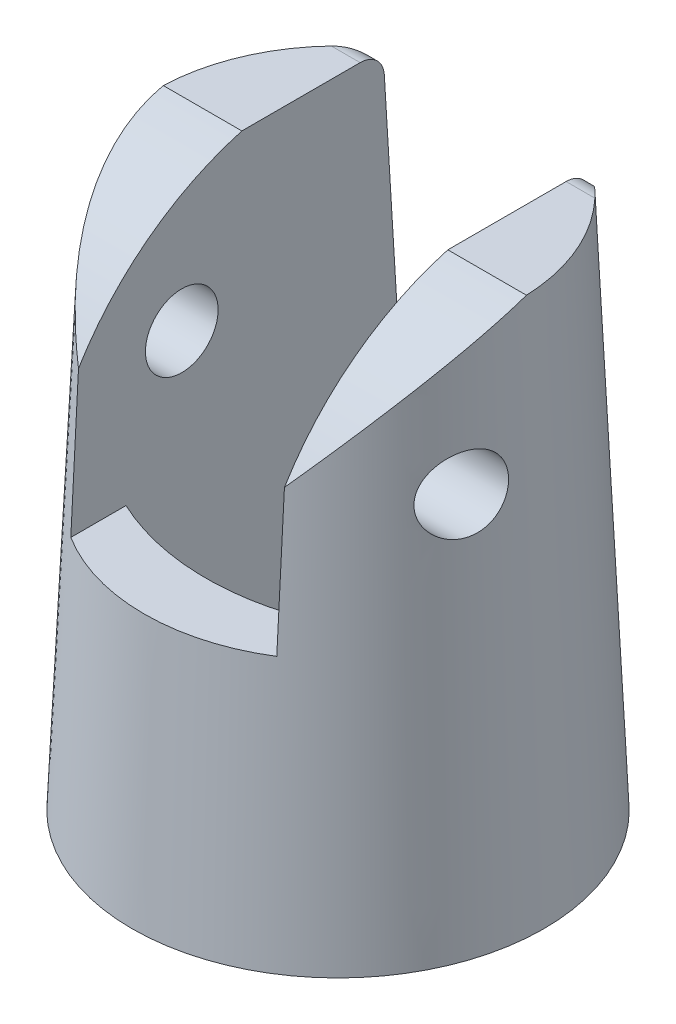
ISO-10303-21;
HEADER;
FILE_DESCRIPTION(('STEP AP214'),'2;1');
FILE_NAME('part.step','',(''),(''),'','','');
FILE_SCHEMA(('AUTOMOTIVE_DESIGN { 1 0 10303 214 1 1 1 1 }'));
ENDSEC;
DATA;
#1=APPLICATION_CONTEXT('core data for automotive mechanical design processes');
#2=APPLICATION_PROTOCOL_DEFINITION('international standard','automotive_design',2000,#1);
#3=PRODUCT_CONTEXT('',#1,'mechanical');
#4=PRODUCT('Part','Part','',(#3));
#5=PRODUCT_RELATED_PRODUCT_CATEGORY('part','',(#4));
#6=PRODUCT_DEFINITION_FORMATION('','',#4);
#7=PRODUCT_DEFINITION_CONTEXT('part definition',#1,'design');
#8=PRODUCT_DEFINITION('design','',#6,#7);
#9=PRODUCT_DEFINITION_SHAPE('','',#8);
#10=(LENGTH_UNIT() NAMED_UNIT(*) SI_UNIT(.MILLI.,.METRE.));
#11=(NAMED_UNIT(*) PLANE_ANGLE_UNIT() SI_UNIT($,.RADIAN.));
#12=(NAMED_UNIT(*) SI_UNIT($,.STERADIAN.) SOLID_ANGLE_UNIT());
#13=UNCERTAINTY_MEASURE_WITH_UNIT(LENGTH_MEASURE(1.E-05),#10,'distance_accuracy_value','');
#14=(GEOMETRIC_REPRESENTATION_CONTEXT(3) GLOBAL_UNCERTAINTY_ASSIGNED_CONTEXT((#13)) GLOBAL_UNIT_ASSIGNED_CONTEXT((#10,
#11,#12)) REPRESENTATION_CONTEXT('',''));
#15=CARTESIAN_POINT('',(0.,0.,0.));
#16=DIRECTION('',(0.,0.,1.));
#17=DIRECTION('',(1.,0.,0.));
#18=AXIS2_PLACEMENT_3D('',#15,#16,#17);
#19=CARTESIAN_POINT('',(-3.542375,9.1685,8.335));
#20=DIRECTION('',(0.,1.,0.));
#21=DIRECTION('',(0.,0.,1.));
#22=AXIS2_PLACEMENT_3D('',#19,#20,#21);
#23=PLANE('',#22);
#24=CARTESIAN_POINT('',(0.,9.1685,-3.79403656817905));
#25=DIRECTION('',(0.,1.,0.));
#26=DIRECTION('',(0.,0.,1.));
#27=AXIS2_PLACEMENT_3D('',#24,#25,#26);
#28=CIRCLE('',#27,8.335);
#29=CARTESIAN_POINT('',(-3.542375,9.1685,3.75075));
#30=VERTEX_POINT('',#29);
#31=CARTESIAN_POINT('',(3.542375,9.1685,3.75075));
#32=VERTEX_POINT('',#31);
#33=EDGE_CURVE('E169',#30,#32,#28,.T.);
#34=ORIENTED_EDGE('',*,*,#33,.F.);
#35=DIRECTION('',(0.,0.,-1.));
#36=VECTOR('',#35,1.);
#37=CARTESIAN_POINT('',(-3.542375,9.1685,8.335));
#38=LINE('',#37,#36);
#39=CARTESIAN_POINT('',(-3.542375,9.1685,5.64923033336179));
#40=VERTEX_POINT('',#39);
#41=EDGE_CURVE('E233',#40,#30,#38,.T.);
#42=ORIENTED_EDGE('',*,*,#41,.F.);
#43=CARTESIAN_POINT('',(0.,9.1685,0.));
#44=DIRECTION('',(0.,1.,0.));
#45=DIRECTION('',(0.,0.,1.));
#46=AXIS2_PLACEMENT_3D('',#43,#44,#45);
#47=CIRCLE('',#46,6.668);
#48=CARTESIAN_POINT('',(3.542375,9.1685,5.64923033336179));
#49=VERTEX_POINT('',#48);
#50=EDGE_CURVE('E340',#49,#40,#47,.F.);
#51=ORIENTED_EDGE('',*,*,#50,.F.);
#52=DIRECTION('',(0.,0.,-1.));
#53=VECTOR('',#52,1.);
#54=CARTESIAN_POINT('',(3.542375,9.1685,8.335));
#55=LINE('',#54,#53);
#56=EDGE_CURVE('E229',#49,#32,#55,.T.);
#57=ORIENTED_EDGE('',*,*,#56,.T.);
#58=EDGE_LOOP('',(#34,#42,#51,#57));
#59=FACE_BOUND('',#58,.T.);
#60=ADVANCED_FACE('F37',(#59),#23,.T.);
#61=CARTESIAN_POINT('',(0.,18.337,0.));
#62=DIRECTION('',(0.,1.,0.));
#63=DIRECTION('',(0.,0.,1.));
#64=AXIS2_PLACEMENT_3D('',#61,#62,#63);
#65=PLANE('',#64);
#66=DIRECTION('',(0.,0.,-1.));
#67=VECTOR('',#66,1.);
#68=CARTESIAN_POINT('',(-3.542375,18.337,0.));
#69=LINE('',#68,#67);
#70=CARTESIAN_POINT('',(-3.542375,18.337,-0.235697768776373));
#71=VERTEX_POINT('',#70);
#72=CARTESIAN_POINT('',(-3.542375,18.337,-4.3043823437462));
#73=VERTEX_POINT('',#72);
#74=EDGE_CURVE('E243',#71,#73,#69,.T.);
#75=ORIENTED_EDGE('',*,*,#74,.T.);
#76=DIRECTION('',(1.,0.,0.));
#77=VECTOR('',#76,1.);
#78=CARTESIAN_POINT('',(-3.63121064125216,18.337,-4.3043823437462));
#79=LINE('',#78,#77);
#80=CARTESIAN_POINT('',(-4.5332579841286,18.337,-4.30438201684954));
#81=VERTEX_POINT('',#80);
#82=EDGE_CURVE('E12',#73,#81,#79,.F.);
#83=ORIENTED_EDGE('',*,*,#82,.T.);
#84=CARTESIAN_POINT('',(0.,18.337,0.));
#85=DIRECTION('',(0.,1.,0.));
#86=DIRECTION('',(0.,0.,1.));
#87=AXIS2_PLACEMENT_3D('',#84,#85,#86);
#88=CIRCLE('',#87,6.25125);
#89=CARTESIAN_POINT('',(-6.24680503331854,18.337,-0.235697768776368));
#90=VERTEX_POINT('',#89);
#91=EDGE_CURVE('E262',#81,#90,#88,.T.);
#92=ORIENTED_EDGE('',*,*,#91,.T.);
#93=DIRECTION('',(-1.,0.,0.));
#94=VECTOR('',#93,1.);
#95=CARTESIAN_POINT('',(8.335,18.337,-0.235697768776373));
#96=LINE('',#95,#94);
#97=EDGE_CURVE('E223',#71,#90,#96,.T.);
#98=ORIENTED_EDGE('',*,*,#97,.F.);
#99=EDGE_LOOP('',(#75,#83,#92,#98));
#100=FACE_BOUND('',#99,.T.);
#101=ADVANCED_FACE('F300',(#100),#65,.T.);
#102=CARTESIAN_POINT('',(6.24680503331854,18.337,-0.235697768776373));
#103=VERTEX_POINT('',#102);
#104=CARTESIAN_POINT('',(4.53325821059433,18.337,-4.30438194016372));
#105=VERTEX_POINT('',#104);
#106=EDGE_CURVE('E264',#103,#105,#88,.T.);
#107=ORIENTED_EDGE('',*,*,#106,.T.);
#108=DIRECTION('',(1.,0.,0.));
#109=VECTOR('',#108,1.);
#110=CARTESIAN_POINT('',(3.542375,18.337,-4.3043823437462));
#111=LINE('',#110,#109);
#112=CARTESIAN_POINT('',(3.542375,18.337,-4.3043823437462));
#113=VERTEX_POINT('',#112);
#114=EDGE_CURVE('E250',#105,#113,#111,.F.);
#115=ORIENTED_EDGE('',*,*,#114,.T.);
#116=DIRECTION('',(0.,0.,1.));
#117=VECTOR('',#116,1.);
#118=CARTESIAN_POINT('',(3.542375,18.337,0.));
#119=LINE('',#118,#117);
#120=CARTESIAN_POINT('',(3.542375,18.337,-0.235697768776373));
#121=VERTEX_POINT('',#120);
#122=EDGE_CURVE('E235',#113,#121,#119,.T.);
#123=ORIENTED_EDGE('',*,*,#122,.T.);
#124=DIRECTION('',(-1.,0.,0.));
#125=VECTOR('',#124,1.);
#126=CARTESIAN_POINT('',(8.335,18.337,-0.235697768776373));
#127=LINE('',#126,#125);
#128=EDGE_CURVE('E185',#103,#121,#127,.T.);
#129=ORIENTED_EDGE('',*,*,#128,.F.);
#130=EDGE_LOOP('',(#107,#115,#123,#129));
#131=FACE_BOUND('',#130,.T.);
#132=ADVANCED_FACE('F306',(#131),#65,.T.);
#133=CARTESIAN_POINT('',(0.,18.337,0.));
#134=DIRECTION('',(0.,-1.,0.));
#135=DIRECTION('',(0.,0.,-1.));
#136=AXIS2_PLACEMENT_3D('',#133,#134,#135);
#137=CONICAL_SURFACE('',#136,6.25125,0.0454232794215771);
#138=CARTESIAN_POINT('',(-6.44684450168824,12.5469195499442,0.935982083114766));
#139=CARTESIAN_POINT('',(-6.44213084680414,12.4974676234636,0.984089259808049));
#140=CARTESIAN_POINT('',(-6.43609796239552,12.452048213362,1.03626387128217));
#141=CARTESIAN_POINT('',(-6.42102930425444,12.3705592802516,1.14712043286898));
#142=CARTESIAN_POINT('',(-6.41199122015662,12.3344969889894,1.20580736638535));
#143=CARTESIAN_POINT('',(-6.39071928647525,12.272673566187,1.32776764561337));
#144=CARTESIAN_POINT('',(-6.37848851077395,12.2469025863543,1.39103653776717));
#145=CARTESIAN_POINT('',(-6.35083649173409,12.2061014770587,1.52025942067385));
#146=CARTESIAN_POINT('',(-6.33541556754886,12.1910702738214,1.58621314229748));
#147=CARTESIAN_POINT('',(-6.3013514073389,12.171673001323,1.7199394934636));
#148=CARTESIAN_POINT('',(-6.28266235203663,12.1674741443271,1.78772450378694));
#149=CARTESIAN_POINT('',(-6.24268020202733,12.1699497977123,1.922313877757));
#150=CARTESIAN_POINT('',(-6.22138644335597,12.1766270858938,1.98911798648128));
#151=CARTESIAN_POINT('',(-6.17559746204439,12.2009962880618,2.12374704818001));
#152=CARTESIAN_POINT('',(-6.15099092551415,12.2192696248222,2.1914286280464));
#153=CARTESIAN_POINT('',(-6.10045072468362,12.2665998612397,2.32238623985707));
#154=CARTESIAN_POINT('',(-6.07451658003009,12.2956606881265,2.38566065738033));
#155=CARTESIAN_POINT('',(-6.02069503154882,12.3659155408065,2.5102282045191));
#156=CARTESIAN_POINT('',(-5.99278698430034,12.4077552284524,2.57114934125187));
#157=CARTESIAN_POINT('',(-5.93796968700231,12.5017787882914,2.68497970028277));
#158=CARTESIAN_POINT('',(-5.91106079918311,12.5539663693158,2.73788603793542));
#159=CARTESIAN_POINT('',(-5.85950236901865,12.6682730995366,2.83466028586837));
#160=CARTESIAN_POINT('',(-5.83488103688773,12.7304954935924,2.87842200887837));
#161=CARTESIAN_POINT('',(-5.79001348457494,12.8630562528383,2.95441096192283));
#162=CARTESIAN_POINT('',(-5.76976426120507,12.9333889957848,2.9866461195694));
#163=CARTESIAN_POINT('',(-5.73687154224249,13.0739742615757,3.03568925010861));
#164=CARTESIAN_POINT('',(-5.72373101265841,13.1437343681785,3.05356811248667));
#165=CARTESIAN_POINT('',(-5.70378346755376,13.2861506930685,3.07706065060647));
#166=CARTESIAN_POINT('',(-5.6969698340047,13.358803802055,3.08268715081189));
#167=CARTESIAN_POINT('',(-5.6906596342409,13.4957541501074,3.08126529142218));
#168=CARTESIAN_POINT('',(-5.69040052126886,13.5600348977494,3.07562231693413));
#169=CARTESIAN_POINT('',(-5.69519726084814,13.686762404484,3.05456222030122));
#170=CARTESIAN_POINT('',(-5.70025248385241,13.7492093799084,3.03914625597046));
#171=CARTESIAN_POINT('',(-5.71492099094543,13.8685429506636,2.99981261131046));
#172=CARTESIAN_POINT('',(-5.72438460307012,13.9255430909838,2.97618012391471));
#173=CARTESIAN_POINT('',(-5.74706538427855,14.0348654967006,2.92119247068003));
#174=CARTESIAN_POINT('',(-5.7602834215061,14.0871866764876,2.88983551891938));
#175=CARTESIAN_POINT('',(-5.79068166755474,14.1897659365263,2.81782677480847));
#176=CARTESIAN_POINT('',(-5.80807903266188,14.2396023611578,2.77666737460873));
#177=CARTESIAN_POINT('',(-5.84516017500779,14.3319496730532,2.68770182210053));
#178=CARTESIAN_POINT('',(-5.8648449767365,14.3744572565655,2.63989268962823));
#179=CARTESIAN_POINT('',(-5.90763668962033,14.4554869136648,2.53348348511041));
#180=CARTESIAN_POINT('',(-5.93088691242596,14.4931409753641,2.47427868302979));
#181=CARTESIAN_POINT('',(-5.97783317075305,14.5580106973553,2.35055393732688));
#182=CARTESIAN_POINT('',(-6.00152936265166,14.585222621823,2.28603210146931));
#183=CARTESIAN_POINT('',(-6.04972490077303,14.6298011189904,2.14934251237633));
#184=CARTESIAN_POINT('',(-6.07419230456156,14.6465131131776,2.07694847117224));
#185=CARTESIAN_POINT('',(-6.12155012977315,14.666875240832,1.92983531035695));
#186=CARTESIAN_POINT('',(-6.14444063785145,14.6705260926112,1.85511631883697));
#187=CARTESIAN_POINT('',(-6.18762619535586,14.6643788167122,1.70655035650808));
#188=CARTESIAN_POINT('',(-6.20795186301275,14.6547599084139,1.63270508830649));
#189=CARTESIAN_POINT('',(-6.24591035195355,14.6223256693928,1.48725228849882));
#190=CARTESIAN_POINT('',(-6.26354390821059,14.5995139486112,1.41564415039555));
#191=CARTESIAN_POINT('',(-6.29523527853176,14.5424199615326,1.28021813119857));
#192=CARTESIAN_POINT('',(-6.30941702426121,14.5086914930603,1.21619557746794));
#193=CARTESIAN_POINT('',(-6.33525879632506,14.4304032708493,1.09458692170832));
#194=CARTESIAN_POINT('',(-6.34691924582804,14.3858453373739,1.03699974036634));
#195=CARTESIAN_POINT('',(-6.36765648831361,14.2886825198197,0.931861263456516));
#196=CARTESIAN_POINT('',(-6.37680152128847,14.2363661623889,0.884056449248225));
#197=CARTESIAN_POINT('',(-6.39329592898539,14.1242321434144,0.797861765690563));
#198=CARTESIAN_POINT('',(-6.40064541018201,14.0644149269832,0.75947133807625));
#199=CARTESIAN_POINT('',(-6.41381646130183,13.9396389736367,0.693649727600453));
#200=CARTESIAN_POINT('',(-6.41965238511365,13.8747367621324,0.666114195302868));
#201=CARTESIAN_POINT('',(-6.43014752262012,13.741145479663,0.622313778122112));
#202=CARTESIAN_POINT('',(-6.43480677757961,13.6724565415984,0.606048497965228));
#203=CARTESIAN_POINT('',(-6.44307186539724,13.5334207182686,0.585315339818554));
#204=CARTESIAN_POINT('',(-6.44668008715857,13.4630779918257,0.580820519713988));
#205=CARTESIAN_POINT('',(-6.45283197533932,13.3225747470083,0.583706844176345));
#206=CARTESIAN_POINT('',(-6.45537545970688,13.2524142618303,0.59109001863263));
#207=CARTESIAN_POINT('',(-6.4592001832807,13.1144706989826,0.61750942923135));
#208=CARTESIAN_POINT('',(-6.46048452662631,13.0466821740526,0.636516819388687));
#209=CARTESIAN_POINT('',(-6.46146343123619,12.9152818088462,0.685622385982268));
#210=CARTESIAN_POINT('',(-6.46115944105787,12.8516662164687,0.715710433603555));
#211=CARTESIAN_POINT('',(-6.45888217282941,12.7467380899058,0.776600969953658));
#212=CARTESIAN_POINT('',(-6.4573792320763,12.704024788446,0.805040507185087));
#213=CARTESIAN_POINT('',(-6.45310726626617,12.6224424244255,0.866902591265935));
#214=CARTESIAN_POINT('',(-6.45033826112169,12.5835733014157,0.900325059738719));
#215=CARTESIAN_POINT('',(-6.44684450168824,12.5469195499442,0.935982083114766));
#216=B_SPLINE_CURVE_WITH_KNOTS('',3,(#138,#139,#140,#141,#142,#143,#144,#145,#146,#147,#148,
#149,#150,#151,#152,#153,#154,#155,#156,#157,#158,#159,#160,#161,#162,#163,#164,#165,#166,#167,
#168,#169,#170,#171,#172,#173,#174,#175,#176,#177,#178,#179,#180,#181,#182,#183,#184,#185,#186,
#187,#188,#189,#190,#191,#192,#193,#194,#195,#196,#197,#198,#199,#200,#201,#202,#203,#204,#205,
#206,#207,#208,#209,#210,#211,#212,#213,#214,#215),.UNSPECIFIED.,.T.,.F.,(4,2,2,2,2,2,2,2,2,2,2,
2,2,2,2,2,2,2,2,2,2,2,2,2,2,2,2,2,2,2,2,2,2,2,2,2,2,2,4),(0.,0.207269033150463,
0.414697782370263,0.621927553772614,0.829136603218595,1.03952558097535,1.24996830113792,
1.4718997671244,1.69391210753272,1.92982257745112,2.16581775435765,2.40441727110694,
2.64285236947706,2.8612003524177,3.07931968194507,3.27192965634699,3.46451681635051,
3.65099495723897,3.83751625302289,4.03750356982662,4.23758080407649,4.45836853201875,
4.67923517645419,4.91277613566142,5.146304250825,5.37670906067892,5.60705085481424,
5.82717340160229,6.0472589748001,6.26059833534247,6.47392504198537,6.68514785413944,
6.89636325784772,7.10709477359421,7.31786230611955,7.52810892047849,7.73816382377891,
7.89179397845878,8.04542171694149),.UNSPECIFIED.);
#217=CARTESIAN_POINT('',(-6.44684450168824,12.5469195499442,0.935982083114766));
#218=VERTEX_POINT('',#217);
#219=EDGE_CURVE('E481',#218,#218,#216,.T.);
#220=ORIENTED_EDGE('',*,*,#219,.F.);
#221=EDGE_LOOP('',(#220));
#222=FACE_BOUND('',#221,.T.);
#223=CARTESIAN_POINT('',(6.44684450168824,12.5469195499442,0.935982083114766));
#224=CARTESIAN_POINT('',(6.45156724773878,12.5964831832079,0.887773726448691));
#225=CARTESIAN_POINT('',(6.45497005310272,12.6501467693707,0.843602276324195));
#226=CARTESIAN_POINT('',(6.45957609089753,12.7641443647295,0.764698452307682));
#227=CARTESIAN_POINT('',(6.46077737234041,12.8244842402895,0.729974473933331));
#228=CARTESIAN_POINT('',(6.46142786526865,12.9500474283856,0.671027282732166));
#229=CARTESIAN_POINT('',(6.46087836630817,13.0152671120905,0.64679635608361));
#230=CARTESIAN_POINT('',(6.45841008911804,13.1487813417469,0.609479362285121));
#231=CARTESIAN_POINT('',(6.45649150846564,13.2170754426857,0.596391687608818));
#232=CARTESIAN_POINT('',(6.45152770260598,13.3553043673824,0.581652488296584));
#233=CARTESIAN_POINT('',(6.44847511120875,13.4252470543455,0.580077158971723));
#234=CARTESIAN_POINT('',(6.44135391545837,13.5643687064331,0.588585503191512));
#235=CARTESIAN_POINT('',(6.43728526199763,13.6335476344753,0.598669740343572));
#236=CARTESIAN_POINT('',(6.4280547020836,13.7695808252007,0.630274055688692));
#237=CARTESIAN_POINT('',(6.42288675499941,13.8364197640426,0.651858355639498));
#238=CARTESIAN_POINT('',(6.41127704507128,13.96545721894,0.705843223141514));
#239=CARTESIAN_POINT('',(6.40483527415199,14.0276557055742,0.738243859263314));
#240=CARTESIAN_POINT('',(6.39036757457753,14.1457931536332,0.812960723697981));
#241=CARTESIAN_POINT('',(6.38233778955921,14.2017163473382,0.855301137722575));
#242=CARTESIAN_POINT('',(6.36437631380661,14.305549467092,0.948534324084998));
#243=CARTESIAN_POINT('',(6.35444466949007,14.3534595886583,0.99942688769102));
#244=CARTESIAN_POINT('',(6.33236443378396,14.4400788220951,1.10830916370024));
#245=CARTESIAN_POINT('',(6.32021029158987,14.4787643247714,1.16631652349316));
#246=CARTESIAN_POINT('',(6.29352791051399,14.5458111378757,1.28751258139403));
#247=CARTESIAN_POINT('',(6.27899961238779,14.5741721906116,1.3507014087801));
#248=CARTESIAN_POINT('',(6.24737989034964,14.6202531506381,1.48110485762851));
#249=CARTESIAN_POINT('',(6.23026055850201,14.6378451411028,1.54835782563863));
#250=CARTESIAN_POINT('',(6.19378491943767,14.6616537481939,1.6842499846979));
#251=CARTESIAN_POINT('',(6.17442827086107,14.6678686265088,1.75288938596096));
#252=CARTESIAN_POINT('',(6.13323252876656,14.6690584993186,1.89189754028371));
#253=CARTESIAN_POINT('',(6.11133394121431,14.663668602647,1.96225160821106));
#254=CARTESIAN_POINT('',(6.06622795386107,14.6412998729167,2.10066142208247));
#255=CARTESIAN_POINT('',(6.04302021418783,14.6243180176204,2.16871656379667));
#256=CARTESIAN_POINT('',(5.99509758581809,14.578332987065,2.30380347732915));
#257=CARTESIAN_POINT('',(5.97036121016982,14.5488357861845,2.37065981910198));
#258=CARTESIAN_POINT('',(5.92150164966217,14.4785454947562,2.49842517606778));
#259=CARTESIAN_POINT('',(5.89737865668888,14.4377489157284,2.55933234669315));
#260=CARTESIAN_POINT('',(5.85076412824461,14.3450448535211,2.67434521262383));
#261=CARTESIAN_POINT('',(5.82830022300646,14.2929895472065,2.72834352188767));
#262=CARTESIAN_POINT('',(5.7869861830754,14.1792133010723,2.82671746356138));
#263=CARTESIAN_POINT('',(5.76813459988898,14.1174962535975,2.8710969539306));
#264=CARTESIAN_POINT('',(5.73676357974865,13.990114511348,2.94594077143296));
#265=CARTESIAN_POINT('',(5.72392001832725,13.9249435360989,2.97710565622323));
#266=CARTESIAN_POINT('',(5.7041987337906,13.7894186593051,3.02788464806837));
#267=CARTESIAN_POINT('',(5.69731486741313,13.7190701761244,3.04751064271316));
#268=CARTESIAN_POINT('',(5.69073484933747,13.5835398710457,3.07276072131491));
#269=CARTESIAN_POINT('',(5.69033722737563,13.5186303297554,3.07967748928568));
#270=CARTESIAN_POINT('',(5.69507307541961,13.3887360464045,3.08333202941172));
#271=CARTESIAN_POINT('',(5.70020533132463,13.3237513239787,3.08007203560664));
#272=CARTESIAN_POINT('',(5.71528537731651,13.1986156589992,3.06405179563576));
#273=CARTESIAN_POINT('',(5.72500373057732,13.1383792539738,3.05173001277658));
#274=CARTESIAN_POINT('',(5.74850457916867,13.0210933133128,3.01871063243723));
#275=CARTESIAN_POINT('',(5.76228793279628,12.9640444537346,2.99801126574343));
#276=CARTESIAN_POINT('',(5.79408522748967,12.8507864589474,2.94747617498041));
#277=CARTESIAN_POINT('',(5.81231178848341,12.7948592359084,2.91714492292704));
#278=CARTESIAN_POINT('',(5.85141748017181,12.6888648739042,2.84891225256633));
#279=CARTESIAN_POINT('',(5.87229780924387,12.6388004021629,2.81100740975703));
#280=CARTESIAN_POINT('',(5.91821823667457,12.5399121982866,2.72385698630374));
#281=CARTESIAN_POINT('',(5.94346082043493,12.4918881485775,2.67380956977488));
#282=CARTESIAN_POINT('',(5.99477777488654,12.4048874114923,2.56674652707054));
#283=CARTESIAN_POINT('',(6.02085253491196,12.3659150316689,2.50972760288084));
#284=CARTESIAN_POINT('',(6.07477809204838,12.2951110358036,2.38519351009895));
#285=CARTESIAN_POINT('',(6.10260581909824,12.2640904148881,2.31720458991631));
#286=CARTESIAN_POINT('',(6.1566806509298,12.214508960065,2.17622080887034));
#287=CARTESIAN_POINT('',(6.18292774080425,12.1959482436519,2.10322590080863));
#288=CARTESIAN_POINT('',(6.23258711131456,12.1722868287829,1.95472849280451));
#289=CARTESIAN_POINT('',(6.25601856389521,12.1670895251454,1.87924800852184));
#290=CARTESIAN_POINT('',(6.29941896528126,12.1705639746043,1.72759364683463));
#291=CARTESIAN_POINT('',(6.3193888497213,12.1792319735192,1.65141996267375));
#292=CARTESIAN_POINT('',(6.35417717694732,12.20966134586,1.50582877695936));
#293=CARTESIAN_POINT('',(6.36924184770664,12.2305583172354,1.43628900382255));
#294=CARTESIAN_POINT('',(6.39567761289294,12.2844063868152,1.30134599555019));
#295=CARTESIAN_POINT('',(6.40705319548208,12.317342733246,1.23593781254524));
#296=CARTESIAN_POINT('',(6.42331431003297,12.3826001797392,1.13057272880604));
#297=CARTESIAN_POINT('',(6.42912094724825,12.4120387156689,1.08894246889128));
#298=CARTESIAN_POINT('',(6.43914029719905,12.4758779411766,1.00946686892267));
#299=CARTESIAN_POINT('',(6.44335309177897,12.510278375834,0.971621334595211));
#300=CARTESIAN_POINT('',(6.44684450168824,12.5469195499442,0.935982083114766));
#301=B_SPLINE_CURVE_WITH_KNOTS('',3,(#223,#224,#225,#226,#227,#228,#229,#230,#231,#232,#233,
#234,#235,#236,#237,#238,#239,#240,#241,#242,#243,#244,#245,#246,#247,#248,#249,#250,#251,#252,
#253,#254,#255,#256,#257,#258,#259,#260,#261,#262,#263,#264,#265,#266,#267,#268,#269,#270,#271,
#272,#273,#274,#275,#276,#277,#278,#279,#280,#281,#282,#283,#284,#285,#286,#287,#288,#289,#290,
#291,#292,#293,#294,#295,#296,#297,#298,#299,#300),.UNSPECIFIED.,.T.,.F.,(4,2,2,2,2,2,2,2,2,2,2,
2,2,2,2,2,2,2,2,2,2,2,2,2,2,2,2,2,2,2,2,2,2,2,2,2,2,2,4),(0.,0.207721021170112,0.41562603562272,
0.623377951045394,0.831099891080695,1.04019541943237,1.24930105559694,1.45958686737995,
1.66987401230347,1.88067823578944,2.09147731493631,2.30281025084862,2.51414846114363,
2.72795059872441,2.94178540045793,3.16244179975033,3.38315575022254,3.61353844846726,
3.84399235266826,4.077678775602,4.31127129636756,4.53014623742875,4.74879529233561,
4.94361942079689,5.1384007837669,5.3243304738696,5.51029944989706,5.70804416245051,
5.90587849113406,6.12638446195403,6.34699515420246,6.58509456294621,6.82319621689074,
7.05957171238137,7.29588321747025,7.51722188822528,7.73829025819106,7.89186118328061,
8.04542422137658),.UNSPECIFIED.);
#302=CARTESIAN_POINT('',(6.44684450168824,12.5469195499442,0.935982083114766));
#303=VERTEX_POINT('',#302);
#304=EDGE_CURVE('E475',#303,#303,#301,.T.);
#305=ORIENTED_EDGE('',*,*,#304,.F.);
#306=EDGE_LOOP('',(#305));
#307=FACE_BOUND('',#306,.T.);
#308=CARTESIAN_POINT('',(0.,34.5041081603902,-4.09963815516641));
#309=DIRECTION('',(0.,-0.061048539534854,0.998134798421867));
#310=DIRECTION('',(0.,-0.998134798421867,-0.061048539534854));
#311=AXIS2_PLACEMENT_3D('',#308,#309,#310);
#312=ELLIPSE('',#311,90.3605801102836,3.69099326310992);
#313=CARTESIAN_POINT('',(3.62522922712261,17.5543839577023,-5.13632769823083));
#314=VERTEX_POINT('',#313);
#315=CARTESIAN_POINT('',(3.542375,9.1685,-5.6492303333618));
#316=VERTEX_POINT('',#315);
#317=EDGE_CURVE('E171',#314,#316,#312,.F.);
#318=ORIENTED_EDGE('',*,*,#317,.F.);
#319=CARTESIAN_POINT('',(3.62522922712261,17.5543839577023,-5.13632769823083));
#320=CARTESIAN_POINT('',(3.6253971745949,17.5835191435355,-5.13458204197893));
#321=CARTESIAN_POINT('',(3.62785684995626,17.6124407533959,-5.1312429928301));
#322=CARTESIAN_POINT('',(3.63675828304929,17.6688884168199,-5.1217944686822));
#323=CARTESIAN_POINT('',(3.64315736018132,17.696426051236,-5.11571487211701));
#324=CARTESIAN_POINT('',(3.66137164352754,17.756397235893,-5.09934388125489));
#325=CARTESIAN_POINT('',(3.67413604047351,17.7883530178643,-5.0883821157273));
#326=CARTESIAN_POINT('',(3.70364974125846,17.849230934616,-5.06351345277676));
#327=CARTESIAN_POINT('',(3.72041710985492,17.878138434752,-5.04959323655008));
#328=CARTESIAN_POINT('',(3.76604460672434,17.9467530692136,-5.01182369410976));
#329=CARTESIAN_POINT('',(3.79671127967941,17.9844507795672,-4.98653080374662));
#330=CARTESIAN_POINT('',(3.86181066792524,18.0533650839513,-4.93231314277612));
#331=CARTESIAN_POINT('',(3.89625114130651,18.0845679294244,-4.90338087164898));
#332=CARTESIAN_POINT('',(3.98598020526752,18.1560385241076,-4.82680375002707));
#333=CARTESIAN_POINT('',(4.04273127487281,18.1924803505367,-4.77730173260936));
#334=CARTESIAN_POINT('',(4.15817705163769,18.2532359610207,-4.67347504779421));
#335=CARTESIAN_POINT('',(4.21687301085586,18.2775417639236,-4.61914723433894));
#336=CARTESIAN_POINT('',(4.31896465012725,18.3094053683784,-4.52149820301442));
#337=CARTESIAN_POINT('',(4.36233779023436,18.319683239889,-4.47902489375348));
#338=CARTESIAN_POINT('',(4.44840121574788,18.3334494794043,-4.39267745596565));
#339=CARTESIAN_POINT('',(4.49109356705381,18.336965415419,-4.34880975969335));
#340=CARTESIAN_POINT('',(4.53325778555091,18.3369999999996,-4.30438153655578));
#341=B_SPLINE_CURVE_WITH_KNOTS('',3,(#319,#320,#321,#322,#323,#324,#325,#326,#327,#328,#329,
#330,#331,#332,#333,#334,#335,#336,#337,#338,#339,#340),.UNSPECIFIED.,.F.,.F.,(4,2,2,2,2,2,2,2,
2,2,4),(0.,0.0872788149635062,0.173628274098217,0.281375446667447,0.389618375482221,
0.553055908841985,0.716835970926982,0.966494825302896,1.21631765014758,1.40065316914791,
1.58423555666858),.UNSPECIFIED.);
#342=EDGE_CURVE('E253',#314,#105,#341,.T.);
#343=ORIENTED_EDGE('',*,*,#342,.T.);
#344=ORIENTED_EDGE('',*,*,#106,.F.);
#345=CARTESIAN_POINT('',(3.27256807982216,13.7525833,5.5693043727464));
#346=CARTESIAN_POINT('',(3.35009959022419,13.8434012026272,5.51895486620554));
#347=CARTESIAN_POINT('',(3.42678467262767,13.9339470984386,5.46682674709469));
#348=CARTESIAN_POINT('',(3.57840388588231,14.1143566996872,5.35895044678828));
#349=CARTESIAN_POINT('',(3.65333790649733,14.2042203619358,5.30320203851189));
#350=CARTESIAN_POINT('',(3.87556197980727,14.4727451433901,5.13032507252135));
#351=CARTESIAN_POINT('',(4.02011644957292,14.6501551741811,5.00766669895136));
#352=CARTESIAN_POINT('',(4.30227433603353,15.0020390967398,4.745953795154));
#353=CARTESIAN_POINT('',(4.43979919622394,15.1764694248276,4.60675533313842));
#354=CARTESIAN_POINT('',(4.70495359954554,15.5192031161875,4.3125921193695));
#355=CARTESIAN_POINT('',(4.83258752588318,15.6875091757093,4.15763442260021));
#356=CARTESIAN_POINT('',(5.15564914291349,16.1237101872372,3.72531411454719));
#357=CARTESIAN_POINT('',(5.34130408072632,16.3853338422596,3.43378819607667));
#358=CARTESIAN_POINT('',(5.58828958378222,16.7558548916322,2.96379551850302));
#359=CARTESIAN_POINT('',(5.66530976571469,16.8756050982326,2.80185163705623));
#360=CARTESIAN_POINT('',(5.80745648385618,17.1068335439243,2.46714380794311));
#361=CARTESIAN_POINT('',(5.87258608990272,17.2183139136474,2.29438266852392));
#362=CARTESIAN_POINT('',(5.97833407924201,17.4117399613541,1.97190129271359));
#363=CARTESIAN_POINT('',(6.02125852164621,17.4953119475771,1.82390795087343));
#364=CARTESIAN_POINT('',(6.09714296244,17.6553899392461,1.52168808069784));
#365=CARTESIAN_POINT('',(6.13010535451499,17.7318976390284,1.36746305982583));
#366=CARTESIAN_POINT('',(6.18504394519229,17.8769918491191,1.05380580539533));
#367=CARTESIAN_POINT('',(6.20704216365366,17.945594021569,0.894384699427815));
#368=CARTESIAN_POINT('',(6.23921106675429,18.0743534642753,0.571071135994146));
#369=CARTESIAN_POINT('',(6.24938939741901,18.1345161716629,0.407181639345385));
#370=CARTESIAN_POINT('',(6.25510250875116,18.2167783930289,0.162589973244041));
#371=CARTESIAN_POINT('',(6.25550834112295,18.2423501232535,0.083133346469309));
#372=CARTESIAN_POINT('',(6.25336536781274,18.2913877436697,-0.0763432714177005));
#373=CARTESIAN_POINT('',(6.250818051333,18.3148546888271,-0.156362958374555));
#374=CARTESIAN_POINT('',(6.24675858661559,18.3372567700001,-0.236617416849999));
#375=B_SPLINE_CURVE_WITH_KNOTS('',3,(#345,#346,#347,#348,#349,#350,#351,#352,#353,#354,#355,
#356,#357,#358,#359,#360,#361,#362,#363,#364,#365,#366,#367,#368,#369,#370,#371,#372,#373,#374),
.UNSPECIFIED.,.F.,.F.,(4,2,2,2,2,2,2,2,2,2,2,2,2,2,4),(0.,0.388747075690504,0.777518558941917,
1.55585041290916,2.34153428568166,3.12686796445958,4.42197440626103,5.06828880321335,
5.7144361018982,6.23984313693249,6.7651238264019,7.28934527603643,7.8132274291152,
8.06357123905526,8.31378886149803),.UNSPECIFIED.);
#376=CARTESIAN_POINT('',(3.542375,14.0715513933138,5.38435994272312));
#377=VERTEX_POINT('',#376);
#378=EDGE_CURVE('E183',#377,#103,#375,.T.);
#379=ORIENTED_EDGE('',*,*,#378,.F.);
#380=CARTESIAN_POINT('',(3.542375,24.0096147224881,4.83450818421378));
#381=CARTESIAN_POINT('',(3.542375,21.9201892005886,4.9522238411458));
#382=CARTESIAN_POINT('',(3.542375,19.8306827448219,5.06849234017952));
#383=CARTESIAN_POINT('',(3.542375,15.651537263945,5.29858654332928));
#384=CARTESIAN_POINT('',(3.542375,13.5618982389642,5.41241224979214));
#385=CARTESIAN_POINT('',(3.542375,9.38251357544668,5.63807257683241));
#386=CARTESIAN_POINT('',(3.542375,7.29276793694451,5.74990719805044));
#387=CARTESIAN_POINT('',(3.542375,3.1131849503556,5.97188824246052));
#388=CARTESIAN_POINT('',(3.542375,1.02334760218293,6.08203466403561));
#389=CARTESIAN_POINT('',(3.542375,-1.06652581123784,6.19148830425332));
#390=B_SPLINE_CURVE_WITH_KNOTS('',3,(#380,#381,#382,#383,#384,#385,#386,#387,#388,#389),
.UNSPECIFIED.,.F.,.F.,(4,2,2,2,4),(0.,6.27821525934256,12.5564244868736,18.834631694437,
25.1128449149092),.UNSPECIFIED.);
#391=EDGE_CURVE('E345',#377,#49,#390,.T.);
#392=ORIENTED_EDGE('',*,*,#391,.T.);
#393=ORIENTED_EDGE('',*,*,#50,.T.);
#394=CARTESIAN_POINT('',(-3.542375,-1.06652581123784,6.19148830425332));
#395=CARTESIAN_POINT('',(-3.542375,1.02334760218292,6.08203466403551));
#396=CARTESIAN_POINT('',(-3.542375,3.1131849503556,5.97188824246046));
#397=CARTESIAN_POINT('',(-3.542375,7.29276793694452,5.7499071980505));
#398=CARTESIAN_POINT('',(-3.542375,9.38251357544669,5.63807257683256));
#399=CARTESIAN_POINT('',(-3.542375,13.5618982389642,5.41241224979229));
#400=CARTESIAN_POINT('',(-3.542375,15.651537263945,5.29858654332934));
#401=CARTESIAN_POINT('',(-3.542375,19.8306827448219,5.06849234017945));
#402=CARTESIAN_POINT('',(-3.542375,21.9201892005886,4.95222384114569));
#403=CARTESIAN_POINT('',(-3.542375,24.0096147224881,4.83450818421377));
#404=B_SPLINE_CURVE_WITH_KNOTS('',3,(#394,#395,#396,#397,#398,#399,#400,#401,#402,#403),
.UNSPECIFIED.,.F.,.F.,(4,2,2,2,4),(0.,6.27821322047222,12.5564204280357,18.8346296555667,
25.1128449149092),.UNSPECIFIED.);
#405=CARTESIAN_POINT('',(-3.542375,14.0715513933138,5.38435994272312));
#406=VERTEX_POINT('',#405);
#407=EDGE_CURVE('E338',#40,#406,#404,.T.);
#408=ORIENTED_EDGE('',*,*,#407,.T.);
#409=CARTESIAN_POINT('',(-6.24675858661559,18.3372567700001,-0.236617416849999));
#410=CARTESIAN_POINT('',(-6.25557677513819,18.2888025183829,-0.0628782893754581));
#411=CARTESIAN_POINT('',(-6.25725304673606,18.2352893620625,0.109731713831662));
#412=CARTESIAN_POINT('',(-6.24721586594524,18.1188200969728,0.451124688238668));
#413=CARTESIAN_POINT('',(-6.23551813320195,18.0558751497152,0.619911915088461));
#414=CARTESIAN_POINT('',(-6.19980913277151,17.9217224837397,0.950970088605494));
#415=CARTESIAN_POINT('',(-6.17591251298458,17.8505963909159,1.11328680036225));
#416=CARTESIAN_POINT('',(-6.11687461078041,17.7003387379211,1.43209376979983));
#417=CARTESIAN_POINT('',(-6.08173026100798,17.6212049980244,1.58858242510723));
#418=CARTESIAN_POINT('',(-6.00143247518855,17.4561215821168,1.89419188739605));
#419=CARTESIAN_POINT('',(-5.95632969204919,17.3702077650861,2.04334546941998));
#420=CARTESIAN_POINT('',(-5.85701643879237,17.1919680072942,2.33465112047581));
#421=CARTESIAN_POINT('',(-5.80280241993917,17.099639576356,2.47680043340858));
#422=CARTESIAN_POINT('',(-5.62762153189302,16.8136158018561,2.89295184463488));
#423=CARTESIAN_POINT('',(-5.49430510492253,16.6112599229871,3.15596620614467));
#424=CARTESIAN_POINT('',(-5.23283522795888,16.233885901465,3.59879179720016));
#425=CARTESIAN_POINT('',(-5.10956468311416,16.0621505495441,3.78442905116129));
#426=CARTESIAN_POINT('',(-4.84950083285579,15.7097985051331,4.13711093726148));
#427=CARTESIAN_POINT('',(-4.71269996277254,15.5291768730965,4.30414505635918));
#428=CARTESIAN_POINT('',(-4.42784292539265,15.1610546278067,4.61987069389663));
#429=CARTESIAN_POINT('',(-4.27978748028907,14.9735544563403,4.76856338768124));
#430=CARTESIAN_POINT('',(-3.97412574770073,14.5933500903071,5.04813890694322));
#431=CARTESIAN_POINT('',(-3.81652427599263,14.4006485464844,5.17903060626641));
#432=CARTESIAN_POINT('',(-3.59219748869453,14.130937799784,5.34857071114848));
#433=CARTESIAN_POINT('',(-3.52903885751673,14.0554817402167,5.39454452514269));
#434=CARTESIAN_POINT('',(-3.40163973960024,13.9042746972022,5.48385734678308));
#435=CARTESIAN_POINT('',(-3.33740200339394,13.8285247577589,5.52720204398717));
#436=CARTESIAN_POINT('',(-3.27256807982226,13.7525833,5.56930437274646));
#437=B_SPLINE_CURVE_WITH_KNOTS('',3,(#409,#410,#411,#412,#413,#414,#415,#416,#417,#418,#419,
#420,#421,#422,#423,#424,#425,#426,#427,#428,#429,#430,#431,#432,#433,#434,#435,#436),
.UNSPECIFIED.,.F.,.F.,(4,2,2,2,2,2,2,2,2,2,2,2,2,4),(0.,0.541429109989572,1.08222248432799,
1.61802444765775,2.15397265359524,2.68725514537951,3.22074582882347,4.29013597033467,
5.13311370486011,5.97656543299133,6.81996308341554,7.66293874443678,7.988742178742,
8.31381336229435),.UNSPECIFIED.);
#438=EDGE_CURVE('E221',#90,#406,#437,.T.);
#439=ORIENTED_EDGE('',*,*,#438,.F.);
#440=ORIENTED_EDGE('',*,*,#91,.F.);
#441=CARTESIAN_POINT('',(-4.53325763985246,18.3369999999997,-4.30438169000142));
#442=CARTESIAN_POINT('',(-4.50192048538148,18.3369900007714,-4.33739235121861));
#443=CARTESIAN_POINT('',(-4.47028886542978,18.3350391930366,-4.37010635637801));
#444=CARTESIAN_POINT('',(-4.40666071083241,18.3273878209806,-4.43474608374189));
#445=CARTESIAN_POINT('',(-4.37466410562653,18.3216865191009,-4.46667164961326));
#446=CARTESIAN_POINT('',(-4.31025893903587,18.3065997019521,-4.5298043471178));
#447=CARTESIAN_POINT('',(-4.27784923707469,18.2971820469495,-4.56100262692786));
#448=CARTESIAN_POINT('',(-4.21317198289608,18.274718911652,-4.62219568694042));
#449=CARTESIAN_POINT('',(-4.18090440353101,18.2616741576944,-4.65219070672462));
#450=CARTESIAN_POINT('',(-4.09758494102615,18.2230281934887,-4.72837515714505));
#451=CARTESIAN_POINT('',(-4.04685212879626,18.194585091219,-4.77350952270907));
#452=CARTESIAN_POINT('',(-3.94829582715099,18.1278359269416,-4.85924566474826));
#453=CARTESIAN_POINT('',(-3.90046262140479,18.089565345878,-4.89986300871116));
#454=CARTESIAN_POINT('',(-3.82922354786193,18.0199014798341,-4.95951433641715));
#455=CARTESIAN_POINT('',(-3.80388462810818,17.9921900301683,-4.98053690417491));
#456=CARTESIAN_POINT('',(-3.75630114421065,17.9324747598755,-5.01991033981241));
#457=CARTESIAN_POINT('',(-3.73405384146169,17.9004747881006,-5.03826357291313));
#458=CARTESIAN_POINT('',(-3.69875170673437,17.8397141142586,-5.06763087124842));
#459=CARTESIAN_POINT('',(-3.68475574216884,17.811856580005,-5.07936610939421));
#460=CARTESIAN_POINT('',(-3.66059450726747,17.7536207842187,-5.10006470006308));
#461=CARTESIAN_POINT('',(-3.65041605924353,17.7232516440859,-5.10903756842511));
#462=CARTESIAN_POINT('',(-3.63718401084068,17.6697776545947,-5.12144280344586));
#463=CARTESIAN_POINT('',(-3.6329145382575,17.6471710193752,-5.12572871478407));
#464=CARTESIAN_POINT('',(-3.62700726506411,17.6012115911903,-5.13246725113653));
#465=CARTESIAN_POINT('',(-3.62538558452621,17.5778551040057,-5.13490859825757));
#466=CARTESIAN_POINT('',(-3.62522922712261,17.5543839577023,-5.13632769823083));
#467=B_SPLINE_CURVE_WITH_KNOTS('',3,(#441,#442,#443,#444,#445,#446,#447,#448,#449,#450,#451,
#452,#453,#454,#455,#456,#457,#458,#459,#460,#461,#462,#463,#464,#465,#466),.UNSPECIFIED.,.F.,
.F.,(4,2,2,2,2,2,2,2,2,2,2,2,4),(0.,0.136487294692901,0.273001438504435,0.410723008082532,
0.548417018346917,0.768542799688656,0.987884751057124,1.11668829776926,1.245377010805,
1.34497276483028,1.44422148893833,1.51420763269635,1.58461829281818),.UNSPECIFIED.);
#468=CARTESIAN_POINT('',(-3.62522922712261,17.5543839577024,-5.13632769823083));
#469=VERTEX_POINT('',#468);
#470=EDGE_CURVE('E387',#81,#469,#467,.T.);
#471=ORIENTED_EDGE('',*,*,#470,.T.);
#472=CARTESIAN_POINT('',(-3.542375,9.1685,-5.64923033336179));
#473=VERTEX_POINT('',#472);
#474=EDGE_CURVE('E180',#473,#469,#312,.F.);
#475=ORIENTED_EDGE('',*,*,#474,.F.);
#476=EDGE_CURVE('E332',#473,#316,#47,.F.);
#477=ORIENTED_EDGE('',*,*,#476,.T.);
#478=EDGE_LOOP('',(#318,#343,#344,#379,#392,#393,#408,#439,#440,#471,#475,#477));
#479=FACE_BOUND('',#478,.T.);
#480=CARTESIAN_POINT('',(0.,0.,0.));
#481=DIRECTION('',(0.,1.,0.));
#482=DIRECTION('',(0.,0.,1.));
#483=AXIS2_PLACEMENT_3D('',#480,#481,#482);
#484=CIRCLE('',#483,7.08475);
#485=CARTESIAN_POINT('',(0.,0.,7.08475));
#486=VERTEX_POINT('',#485);
#487=EDGE_CURVE('E275',#486,#486,#484,.T.);
#488=ORIENTED_EDGE('',*,*,#487,.T.);
#489=EDGE_LOOP('',(#488));
#490=FACE_BOUND('',#489,.T.);
#491=ADVANCED_FACE('F195',(#222,#307,#479,#490),#137,.T.);
#492=CARTESIAN_POINT('',(0.,0.,0.));
#493=DIRECTION('',(0.,1.,0.));
#494=DIRECTION('',(0.,0.,1.));
#495=AXIS2_PLACEMENT_3D('',#492,#493,#494);
#496=PLANE('',#495);
#497=DIRECTION('',(0.,0.,-1.));
#498=VECTOR('',#497,1.);
#499=CARTESIAN_POINT('',(-3.542375,0.,3.75075));
#500=LINE('',#499,#498);
#501=CARTESIAN_POINT('',(-3.542375,0.,3.75075));
#502=VERTEX_POINT('',#501);
#503=CARTESIAN_POINT('',(-3.542375,0.,-3.75075));
#504=VERTEX_POINT('',#503);
#505=EDGE_CURVE('E149',#502,#504,#500,.T.);
#506=ORIENTED_EDGE('',*,*,#505,.F.);
#507=CARTESIAN_POINT('',(0.,0.,-3.79403656817905));
#508=DIRECTION('',(0.,-1.,0.));
#509=DIRECTION('',(0.,0.,1.));
#510=AXIS2_PLACEMENT_3D('',#507,#508,#509);
#511=CIRCLE('',#510,8.335);
#512=CARTESIAN_POINT('',(3.542375,0.,3.75075));
#513=VERTEX_POINT('',#512);
#514=EDGE_CURVE('E154',#513,#502,#511,.T.);
#515=ORIENTED_EDGE('',*,*,#514,.F.);
#516=DIRECTION('',(0.,0.,1.));
#517=VECTOR('',#516,1.);
#518=CARTESIAN_POINT('',(3.542375,0.,3.75075));
#519=LINE('',#518,#517);
#520=CARTESIAN_POINT('',(3.542375,0.,-3.75075));
#521=VERTEX_POINT('',#520);
#522=EDGE_CURVE('E159',#521,#513,#519,.T.);
#523=ORIENTED_EDGE('',*,*,#522,.F.);
#524=CARTESIAN_POINT('',(0.,0.,3.79403656817905));
#525=DIRECTION('',(0.,-1.,0.));
#526=DIRECTION('',(0.,0.,1.));
#527=AXIS2_PLACEMENT_3D('',#524,#525,#526);
#528=CIRCLE('',#527,8.335);
#529=EDGE_CURVE('E138',#504,#521,#528,.T.);
#530=ORIENTED_EDGE('',*,*,#529,.F.);
#531=EDGE_LOOP('',(#506,#515,#523,#530));
#532=FACE_BOUND('',#531,.T.);
#533=ORIENTED_EDGE('',*,*,#487,.F.);
#534=EDGE_LOOP('',(#533));
#535=FACE_BOUND('',#534,.T.);
#536=ADVANCED_FACE('F156',(#532,#535),#496,.F.);
#537=CARTESIAN_POINT('',(-3.54237500000001,29.6801900982261,8.335));
#538=DIRECTION('',(1.,0.,0.));
#539=DIRECTION('',(0.,1.,0.));
#540=AXIS2_PLACEMENT_3D('',#537,#538,#539);
#541=PLANE('',#540);
#542=CARTESIAN_POINT('',(-3.542375,13.4185,1.832));
#543=DIRECTION('',(1.,0.,0.));
#544=DIRECTION('',(0.,1.,0.));
#545=AXIS2_PLACEMENT_3D('',#542,#543,#544);
#546=CIRCLE('',#545,1.25);
#547=CARTESIAN_POINT('',(-3.542375,14.6685,1.832));
#548=VERTEX_POINT('',#547);
#549=EDGE_CURVE('E500',#548,#548,#546,.T.);
#550=ORIENTED_EDGE('',*,*,#549,.F.);
#551=EDGE_LOOP('',(#550));
#552=FACE_BOUND('',#551,.T.);
#553=DIRECTION('',(0.,-0.998134798421867,-0.061048539534854));
#554=VECTOR('',#553,1.);
#555=CARTESIAN_POINT('',(-3.54237500000001,30.4558690688164,-4.34723906500266));
#556=LINE('',#555,#554);
#557=CARTESIAN_POINT('',(-3.542375,17.5543839577023,-5.13632769823083));
#558=VERTEX_POINT('',#557);
#559=EDGE_CURVE('E174',#558,#473,#556,.T.);
#560=ORIENTED_EDGE('',*,*,#559,.F.);
#561=CARTESIAN_POINT('',(-3.542375,17.5035,-4.3043823437462));
#562=DIRECTION('',(1.,0.,0.));
#563=DIRECTION('',(0.,1.,0.));
#564=AXIS2_PLACEMENT_3D('',#561,#562,#563);
#565=CIRCLE('',#564,0.8335);
#566=EDGE_CURVE('E47',#558,#73,#565,.T.);
#567=ORIENTED_EDGE('',*,*,#566,.T.);
#568=ORIENTED_EDGE('',*,*,#74,.F.);
#569=CARTESIAN_POINT('',(-3.542375,9.10497347812908,-2.8138179874574));
#570=DIRECTION('',(1.,0.,0.));
#571=DIRECTION('',(0.,1.,0.));
#572=AXIS2_PLACEMENT_3D('',#569,#570,#571);
#573=CIRCLE('',#572,9.58525);
#574=EDGE_CURVE('E397',#406,#71,#573,.F.);
#575=ORIENTED_EDGE('',*,*,#574,.F.);
#576=ORIENTED_EDGE('',*,*,#407,.F.);
#577=ORIENTED_EDGE('',*,*,#41,.T.);
#578=DIRECTION('',(0.,-1.,0.));
#579=VECTOR('',#578,1.);
#580=CARTESIAN_POINT('',(-3.542375,11.669,3.75075));
#581=LINE('',#580,#579);
#582=EDGE_CURVE('E145',#30,#502,#581,.T.);
#583=ORIENTED_EDGE('',*,*,#582,.T.);
#584=ORIENTED_EDGE('',*,*,#505,.T.);
#585=DIRECTION('',(0.,-1.,0.));
#586=VECTOR('',#585,1.);
#587=CARTESIAN_POINT('',(-3.542375,11.669,-3.75075));
#588=LINE('',#587,#586);
#589=CARTESIAN_POINT('',(-3.542375,9.1685,-3.75075));
#590=VERTEX_POINT('',#589);
#591=EDGE_CURVE('E134',#590,#504,#588,.T.);
#592=ORIENTED_EDGE('',*,*,#591,.F.);
#593=EDGE_CURVE('E232',#590,#473,#38,.T.);
#594=ORIENTED_EDGE('',*,*,#593,.T.);
#595=EDGE_LOOP('',(#560,#567,#568,#575,#576,#577,#583,#584,#592,#594));
#596=FACE_BOUND('',#595,.T.);
#597=ADVANCED_FACE('F150',(#552,#596),#541,.T.);
#598=CARTESIAN_POINT('',(0.,9.1685,3.79403656817905));
#599=DIRECTION('',(0.,1.,0.));
#600=DIRECTION('',(0.,0.,1.));
#601=AXIS2_PLACEMENT_3D('',#598,#599,#600);
#602=CIRCLE('',#601,8.335);
#603=CARTESIAN_POINT('',(3.542375,9.1685,-3.75075));
#604=VERTEX_POINT('',#603);
#605=EDGE_CURVE('E141',#604,#590,#602,.T.);
#606=ORIENTED_EDGE('',*,*,#605,.F.);
#607=EDGE_CURVE('E226',#604,#316,#55,.T.);
#608=ORIENTED_EDGE('',*,*,#607,.T.);
#609=ORIENTED_EDGE('',*,*,#476,.F.);
#610=ORIENTED_EDGE('',*,*,#593,.F.);
#611=EDGE_LOOP('',(#606,#608,#609,#610));
#612=FACE_BOUND('',#611,.T.);
#613=ADVANCED_FACE('F302',(#612),#23,.T.);
#614=CARTESIAN_POINT('',(3.542375,29.6801900982261,8.335));
#615=DIRECTION('',(-1.,0.,0.));
#616=DIRECTION('',(0.,-1.,0.));
#617=AXIS2_PLACEMENT_3D('',#614,#615,#616);
#618=PLANE('',#617);
#619=CARTESIAN_POINT('',(3.542375,13.4185,1.832));
#620=DIRECTION('',(-1.,0.,0.));
#621=DIRECTION('',(0.,-1.,0.));
#622=AXIS2_PLACEMENT_3D('',#619,#620,#621);
#623=CIRCLE('',#622,1.25);
#624=CARTESIAN_POINT('',(3.542375,12.1685,1.832));
#625=VERTEX_POINT('',#624);
#626=EDGE_CURVE('E42',#625,#625,#623,.T.);
#627=ORIENTED_EDGE('',*,*,#626,.F.);
#628=EDGE_LOOP('',(#627));
#629=FACE_BOUND('',#628,.T.);
#630=ORIENTED_EDGE('',*,*,#122,.F.);
#631=CARTESIAN_POINT('',(3.542375,17.5035,-4.3043823437462));
#632=DIRECTION('',(-1.,0.,0.));
#633=DIRECTION('',(0.,-1.,0.));
#634=AXIS2_PLACEMENT_3D('',#631,#632,#633);
#635=CIRCLE('',#634,0.8335);
#636=CARTESIAN_POINT('',(3.542375,17.5543839577023,-5.13632769823083));
#637=VERTEX_POINT('',#636);
#638=EDGE_CURVE('E252',#113,#637,#635,.T.);
#639=ORIENTED_EDGE('',*,*,#638,.T.);
#640=DIRECTION('',(0.,0.998134798421867,0.061048539534854));
#641=VECTOR('',#640,1.);
#642=CARTESIAN_POINT('',(3.542375,30.4558690688164,-4.34723906500266));
#643=LINE('',#642,#641);
#644=EDGE_CURVE('E326',#316,#637,#643,.T.);
#645=ORIENTED_EDGE('',*,*,#644,.F.);
#646=ORIENTED_EDGE('',*,*,#607,.F.);
#647=DIRECTION('',(0.,-1.,0.));
#648=VECTOR('',#647,1.);
#649=CARTESIAN_POINT('',(3.542375,11.669,-3.75075));
#650=LINE('',#649,#648);
#651=EDGE_CURVE('E144',#604,#521,#650,.T.);
#652=ORIENTED_EDGE('',*,*,#651,.T.);
#653=ORIENTED_EDGE('',*,*,#522,.T.);
#654=DIRECTION('',(0.,-1.,0.));
#655=VECTOR('',#654,1.);
#656=CARTESIAN_POINT('',(3.542375,11.669,3.75075));
#657=LINE('',#656,#655);
#658=EDGE_CURVE('E164',#32,#513,#657,.T.);
#659=ORIENTED_EDGE('',*,*,#658,.F.);
#660=ORIENTED_EDGE('',*,*,#56,.F.);
#661=ORIENTED_EDGE('',*,*,#391,.F.);
#662=CARTESIAN_POINT('',(3.542375,9.10497347812908,-2.8138179874574));
#663=DIRECTION('',(-1.,0.,0.));
#664=DIRECTION('',(0.,-1.,0.));
#665=AXIS2_PLACEMENT_3D('',#662,#663,#664);
#666=CIRCLE('',#665,9.58525);
#667=EDGE_CURVE('E331',#121,#377,#666,.F.);
#668=ORIENTED_EDGE('',*,*,#667,.F.);
#669=EDGE_LOOP('',(#630,#639,#645,#646,#652,#653,#659,#660,#661,#668));
#670=FACE_BOUND('',#669,.T.);
#671=ADVANCED_FACE('F209',(#629,#670),#618,.T.);
#672=CARTESIAN_POINT('',(8.335,0.378404300073872,-6.18685561774275));
#673=DIRECTION('',(0.,-0.061048539534854,0.998134798421867));
#674=DIRECTION('',(0.,-0.998134798421867,-0.061048539534854));
#675=AXIS2_PLACEMENT_3D('',#672,#673,#674);
#676=PLANE('',#675);
#677=ORIENTED_EDGE('',*,*,#644,.T.);
#678=DIRECTION('',(1.,0.,0.));
#679=VECTOR('',#678,1.);
#680=CARTESIAN_POINT('',(3.63121407702303,17.5543839577023,-5.13632769823083));
#681=LINE('',#680,#679);
#682=EDGE_CURVE('E365',#637,#314,#681,.T.);
#683=ORIENTED_EDGE('',*,*,#682,.T.);
#684=ORIENTED_EDGE('',*,*,#317,.T.);
#685=EDGE_LOOP('',(#677,#683,#684));
#686=FACE_BOUND('',#685,.T.);
#687=ADVANCED_FACE('F205',(#686),#676,.F.);
#688=CARTESIAN_POINT('',(8.335,9.10497347812908,-2.8138179874574));
#689=DIRECTION('',(-1.,0.,0.));
#690=DIRECTION('',(0.,0.,1.));
#691=AXIS2_PLACEMENT_3D('',#688,#689,#690);
#692=CYLINDRICAL_SURFACE('',#691,9.58525);
#693=ORIENTED_EDGE('',*,*,#128,.T.);
#694=ORIENTED_EDGE('',*,*,#667,.T.);
#695=ORIENTED_EDGE('',*,*,#378,.T.);
#696=EDGE_LOOP('',(#693,#694,#695));
#697=FACE_BOUND('',#696,.T.);
#698=ADVANCED_FACE('F199',(#697),#692,.T.);
#699=ORIENTED_EDGE('',*,*,#474,.T.);
#700=DIRECTION('',(1.,0.,0.));
#701=VECTOR('',#700,1.);
#702=CARTESIAN_POINT('',(-3.54237500000001,17.5543839577023,-5.13632769823083));
#703=LINE('',#702,#701);
#704=EDGE_CURVE('E257',#469,#558,#703,.T.);
#705=ORIENTED_EDGE('',*,*,#704,.T.);
#706=ORIENTED_EDGE('',*,*,#559,.T.);
#707=EDGE_LOOP('',(#699,#705,#706));
#708=FACE_BOUND('',#707,.T.);
#709=ADVANCED_FACE('F204',(#708),#676,.F.);
#710=ORIENTED_EDGE('',*,*,#97,.T.);
#711=ORIENTED_EDGE('',*,*,#438,.T.);
#712=ORIENTED_EDGE('',*,*,#574,.T.);
#713=EDGE_LOOP('',(#710,#711,#712));
#714=FACE_BOUND('',#713,.T.);
#715=ADVANCED_FACE('F207',(#714),#692,.T.);
#716=CARTESIAN_POINT('',(0.,11.669,-3.79403656817905));
#717=DIRECTION('',(0.,-1.,0.));
#718=DIRECTION('',(0.,0.,-1.));
#719=AXIS2_PLACEMENT_3D('',#716,#717,#718);
#720=CYLINDRICAL_SURFACE('',#719,8.335);
#721=ORIENTED_EDGE('',*,*,#33,.T.);
#722=ORIENTED_EDGE('',*,*,#658,.T.);
#723=ORIENTED_EDGE('',*,*,#514,.T.);
#724=ORIENTED_EDGE('',*,*,#582,.F.);
#725=EDGE_LOOP('',(#721,#722,#723,#724));
#726=FACE_BOUND('',#725,.T.);
#727=ADVANCED_FACE('F296',(#726),#720,.F.);
#728=CARTESIAN_POINT('',(0.,11.669,3.79403656817905));
#729=DIRECTION('',(0.,-1.,0.));
#730=DIRECTION('',(0.,0.,-1.));
#731=AXIS2_PLACEMENT_3D('',#728,#729,#730);
#732=CYLINDRICAL_SURFACE('',#731,8.335);
#733=ORIENTED_EDGE('',*,*,#605,.T.);
#734=ORIENTED_EDGE('',*,*,#591,.T.);
#735=ORIENTED_EDGE('',*,*,#529,.T.);
#736=ORIENTED_EDGE('',*,*,#651,.F.);
#737=EDGE_LOOP('',(#733,#734,#735,#736));
#738=FACE_BOUND('',#737,.T.);
#739=ADVANCED_FACE('F136',(#738),#732,.F.);
#740=CARTESIAN_POINT('',(8.335,17.5035,-4.3043823437462));
#741=DIRECTION('',(-1.,0.,0.));
#742=DIRECTION('',(0.,0.,1.));
#743=AXIS2_PLACEMENT_3D('',#740,#741,#742);
#744=CYLINDRICAL_SURFACE('',#743,0.8335);
#745=ORIENTED_EDGE('',*,*,#638,.F.);
#746=ORIENTED_EDGE('',*,*,#114,.F.);
#747=ORIENTED_EDGE('',*,*,#342,.F.);
#748=ORIENTED_EDGE('',*,*,#682,.F.);
#749=EDGE_LOOP('',(#745,#746,#747,#748));
#750=FACE_BOUND('',#749,.T.);
#751=ADVANCED_FACE('F287',(#750),#744,.T.);
#752=CARTESIAN_POINT('',(8.335,17.5035,-4.3043823437462));
#753=DIRECTION('',(-1.,0.,0.));
#754=DIRECTION('',(0.,0.,1.));
#755=AXIS2_PLACEMENT_3D('',#752,#753,#754);
#756=CYLINDRICAL_SURFACE('',#755,0.8335);
#757=ORIENTED_EDGE('',*,*,#470,.F.);
#758=ORIENTED_EDGE('',*,*,#82,.F.);
#759=ORIENTED_EDGE('',*,*,#566,.F.);
#760=ORIENTED_EDGE('',*,*,#704,.F.);
#761=EDGE_LOOP('',(#757,#758,#759,#760));
#762=FACE_BOUND('',#761,.T.);
#763=ADVANCED_FACE('F39',(#762),#756,.T.);
#764=CARTESIAN_POINT('',(-10.,13.4185,1.832));
#765=DIRECTION('',(1.,0.,0.));
#766=DIRECTION('',(0.,0.,-1.));
#767=AXIS2_PLACEMENT_3D('',#764,#765,#766);
#768=CYLINDRICAL_SURFACE('',#767,1.25);
#769=ORIENTED_EDGE('',*,*,#304,.T.);
#770=EDGE_LOOP('',(#769));
#771=FACE_BOUND('',#770,.T.);
#772=ORIENTED_EDGE('',*,*,#626,.T.);
#773=EDGE_LOOP('',(#772));
#774=FACE_BOUND('',#773,.T.);
#775=ADVANCED_FACE('F295',(#771,#774),#768,.F.);
#776=ORIENTED_EDGE('',*,*,#219,.T.);
#777=EDGE_LOOP('',(#776));
#778=FACE_BOUND('',#777,.T.);
#779=ORIENTED_EDGE('',*,*,#549,.T.);
#780=EDGE_LOOP('',(#779));
#781=FACE_BOUND('',#780,.T.);
#782=ADVANCED_FACE('F457',(#778,#781),#768,.F.);
#783=CLOSED_SHELL('',(#60,#101,#132,#491,#536,#597,#613,#671,#687,#698,#709,#715,#727,#739,#751,
#763,#775,#782));
#784=MANIFOLD_SOLID_BREP('B2',#783);
#785=ADVANCED_BREP_SHAPE_REPRESENTATION('',(#18,#784),#14);
#786=SHAPE_DEFINITION_REPRESENTATION(#9,#785);
ENDSEC;
END-ISO-10303-21;
